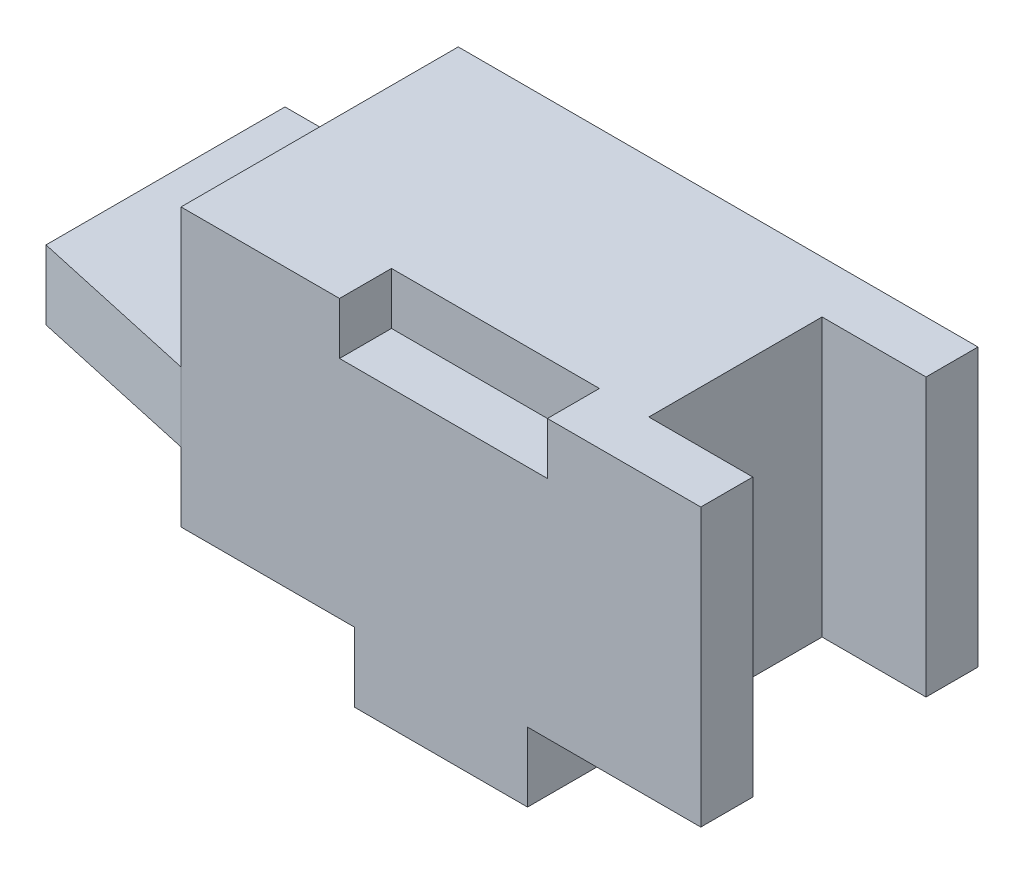
ISO-10303-21;
HEADER;
FILE_DESCRIPTION(('STEP AP214'),'2;1');
FILE_NAME('part.step','',(''),(''),'','','');
FILE_SCHEMA(('AUTOMOTIVE_DESIGN { 1 0 10303 214 1 1 1 1 }'));
ENDSEC;
DATA;
#1=APPLICATION_CONTEXT('core data for automotive mechanical design processes');
#2=APPLICATION_PROTOCOL_DEFINITION('international standard','automotive_design',2000,#1);
#3=PRODUCT_CONTEXT('',#1,'mechanical');
#4=PRODUCT('Part','Part','',(#3));
#5=PRODUCT_RELATED_PRODUCT_CATEGORY('part','',(#4));
#6=PRODUCT_DEFINITION_FORMATION('','',#4);
#7=PRODUCT_DEFINITION_CONTEXT('part definition',#1,'design');
#8=PRODUCT_DEFINITION('design','',#6,#7);
#9=PRODUCT_DEFINITION_SHAPE('','',#8);
#10=(LENGTH_UNIT() NAMED_UNIT(*) SI_UNIT(.MILLI.,.METRE.));
#11=(NAMED_UNIT(*) PLANE_ANGLE_UNIT() SI_UNIT($,.RADIAN.));
#12=(NAMED_UNIT(*) SI_UNIT($,.STERADIAN.) SOLID_ANGLE_UNIT());
#13=UNCERTAINTY_MEASURE_WITH_UNIT(LENGTH_MEASURE(1.E-05),#10,'distance_accuracy_value','');
#14=(GEOMETRIC_REPRESENTATION_CONTEXT(3) GLOBAL_UNCERTAINTY_ASSIGNED_CONTEXT((#13)) GLOBAL_UNIT_ASSIGNED_CONTEXT((#10,
#11,#12)) REPRESENTATION_CONTEXT('',''));
#15=CARTESIAN_POINT('',(0.,0.,0.));
#16=DIRECTION('',(0.,0.,1.));
#17=DIRECTION('',(1.,0.,0.));
#18=AXIS2_PLACEMENT_3D('',#15,#16,#17);
#19=CARTESIAN_POINT('',(150.,0.,80.));
#20=DIRECTION('',(-1.,0.,0.));
#21=DIRECTION('',(0.,-1.,0.));
#22=AXIS2_PLACEMENT_3D('',#19,#20,#21);
#23=PLANE('',#22);
#24=DIRECTION('',(0.,-1.,0.));
#25=VECTOR('',#24,1.);
#26=CARTESIAN_POINT('',(150.,0.,15.));
#27=LINE('',#26,#25);
#28=CARTESIAN_POINT('',(150.,0.,15.));
#29=VERTEX_POINT('',#28);
#30=CARTESIAN_POINT('',(150.,-80.,15.));
#31=VERTEX_POINT('',#30);
#32=EDGE_CURVE('E203',#29,#31,#27,.T.);
#33=ORIENTED_EDGE('',*,*,#32,.T.);
#34=DIRECTION('',(0.,0.,-1.));
#35=VECTOR('',#34,1.);
#36=CARTESIAN_POINT('',(150.,-80.,80.));
#37=LINE('',#36,#35);
#38=CARTESIAN_POINT('',(150.,-80.,0.));
#39=VERTEX_POINT('',#38);
#40=EDGE_CURVE('E318',#31,#39,#37,.T.);
#41=ORIENTED_EDGE('',*,*,#40,.T.);
#42=DIRECTION('',(0.,1.,0.));
#43=VECTOR('',#42,1.);
#44=CARTESIAN_POINT('',(150.,0.,0.));
#45=LINE('',#44,#43);
#46=CARTESIAN_POINT('',(150.,0.,0.));
#47=VERTEX_POINT('',#46);
#48=EDGE_CURVE('E289',#39,#47,#45,.T.);
#49=ORIENTED_EDGE('',*,*,#48,.T.);
#50=DIRECTION('',(0.,0.,-1.));
#51=VECTOR('',#50,1.);
#52=CARTESIAN_POINT('',(150.,0.,80.));
#53=LINE('',#52,#51);
#54=EDGE_CURVE('E315',#29,#47,#53,.T.);
#55=ORIENTED_EDGE('',*,*,#54,.F.);
#56=EDGE_LOOP('',(#33,#41,#49,#55));
#57=FACE_BOUND('',#56,.T.);
#58=ADVANCED_FACE('F36',(#57),#23,.F.);
#59=CARTESIAN_POINT('',(0.,0.,80.));
#60=DIRECTION('',(0.,0.,1.));
#61=DIRECTION('',(1.,0.,0.));
#62=AXIS2_PLACEMENT_3D('',#59,#60,#61);
#63=PLANE('',#62);
#64=DIRECTION('',(0.,-1.,0.));
#65=VECTOR('',#64,1.);
#66=CARTESIAN_POINT('',(45.7392344935598,0.,80.));
#67=LINE('',#66,#65);
#68=CARTESIAN_POINT('',(45.7392344935598,0.,80.));
#69=VERTEX_POINT('',#68);
#70=CARTESIAN_POINT('',(45.7392344935598,-15.,80.));
#71=VERTEX_POINT('',#70);
#72=EDGE_CURVE('E191',#69,#71,#67,.T.);
#73=ORIENTED_EDGE('',*,*,#72,.F.);
#74=DIRECTION('',(-1.,0.,0.));
#75=VECTOR('',#74,1.);
#76=CARTESIAN_POINT('',(0.,0.,80.));
#77=LINE('',#76,#75);
#78=CARTESIAN_POINT('',(0.,0.,80.));
#79=VERTEX_POINT('',#78);
#80=EDGE_CURVE('E271',#69,#79,#77,.T.);
#81=ORIENTED_EDGE('',*,*,#80,.T.);
#82=DIRECTION('',(0.,1.,0.));
#83=VECTOR('',#82,1.);
#84=CARTESIAN_POINT('',(0.,0.,80.));
#85=LINE('',#84,#83);
#86=CARTESIAN_POINT('',(0.,-40.,80.));
#87=VERTEX_POINT('',#86);
#88=EDGE_CURVE('E275',#87,#79,#85,.T.);
#89=ORIENTED_EDGE('',*,*,#88,.F.);
#90=DIRECTION('',(0.,1.,0.));
#91=VECTOR('',#90,1.);
#92=CARTESIAN_POINT('',(0.,-381.858552175948,80.));
#93=LINE('',#92,#91);
#94=CARTESIAN_POINT('',(0.,-60.,80.));
#95=VERTEX_POINT('',#94);
#96=EDGE_CURVE('E235',#95,#87,#93,.T.);
#97=ORIENTED_EDGE('',*,*,#96,.F.);
#98=CARTESIAN_POINT('',(0.,-80.,80.));
#99=VERTEX_POINT('',#98);
#100=EDGE_CURVE('E276',#99,#95,#85,.T.);
#101=ORIENTED_EDGE('',*,*,#100,.F.);
#102=DIRECTION('',(-1.,0.,0.));
#103=VECTOR('',#102,1.);
#104=CARTESIAN_POINT('',(0.,-80.,80.));
#105=LINE('',#104,#103);
#106=CARTESIAN_POINT('',(50.,-80.,80.));
#107=VERTEX_POINT('',#106);
#108=EDGE_CURVE('E269',#107,#99,#105,.T.);
#109=ORIENTED_EDGE('',*,*,#108,.F.);
#110=DIRECTION('',(0.,-1.,0.));
#111=VECTOR('',#110,1.);
#112=CARTESIAN_POINT('',(50.,0.,80.));
#113=LINE('',#112,#111);
#114=CARTESIAN_POINT('',(50.,-100.,80.));
#115=VERTEX_POINT('',#114);
#116=EDGE_CURVE('E279',#107,#115,#113,.T.);
#117=ORIENTED_EDGE('',*,*,#116,.T.);
#118=DIRECTION('',(1.,0.,0.));
#119=VECTOR('',#118,1.);
#120=CARTESIAN_POINT('',(0.,-100.,80.));
#121=LINE('',#120,#119);
#122=CARTESIAN_POINT('',(100.,-100.,80.));
#123=VERTEX_POINT('',#122);
#124=EDGE_CURVE('E281',#115,#123,#121,.T.);
#125=ORIENTED_EDGE('',*,*,#124,.T.);
#126=DIRECTION('',(0.,-1.,0.));
#127=VECTOR('',#126,1.);
#128=CARTESIAN_POINT('',(100.,0.,80.));
#129=LINE('',#128,#127);
#130=CARTESIAN_POINT('',(100.,-80.,80.));
#131=VERTEX_POINT('',#130);
#132=EDGE_CURVE('E261',#131,#123,#129,.T.);
#133=ORIENTED_EDGE('',*,*,#132,.F.);
#134=CARTESIAN_POINT('',(150.,-80.,80.));
#135=VERTEX_POINT('',#134);
#136=EDGE_CURVE('E264',#135,#131,#105,.T.);
#137=ORIENTED_EDGE('',*,*,#136,.F.);
#138=DIRECTION('',(0.,1.,0.));
#139=VECTOR('',#138,1.);
#140=CARTESIAN_POINT('',(150.,0.,80.));
#141=LINE('',#140,#139);
#142=CARTESIAN_POINT('',(150.,0.,80.));
#143=VERTEX_POINT('',#142);
#144=EDGE_CURVE('E268',#135,#143,#141,.T.);
#145=ORIENTED_EDGE('',*,*,#144,.T.);
#146=CARTESIAN_POINT('',(105.73923449356,0.,80.));
#147=VERTEX_POINT('',#146);
#148=EDGE_CURVE('E272',#143,#147,#77,.T.);
#149=ORIENTED_EDGE('',*,*,#148,.T.);
#150=DIRECTION('',(0.,-1.,0.));
#151=VECTOR('',#150,1.);
#152=CARTESIAN_POINT('',(105.73923449356,0.,80.));
#153=LINE('',#152,#151);
#154=CARTESIAN_POINT('',(105.73923449356,-15.,80.));
#155=VERTEX_POINT('',#154);
#156=EDGE_CURVE('E194',#147,#155,#153,.T.);
#157=ORIENTED_EDGE('',*,*,#156,.T.);
#158=DIRECTION('',(1.,0.,0.));
#159=VECTOR('',#158,1.);
#160=CARTESIAN_POINT('',(45.7392344935598,-15.,80.));
#161=LINE('',#160,#159);
#162=EDGE_CURVE('E185',#71,#155,#161,.T.);
#163=ORIENTED_EDGE('',*,*,#162,.F.);
#164=EDGE_LOOP('',(#73,#81,#89,#97,#101,#109,#117,#125,#133,#137,#145,#149,#157,#163));
#165=FACE_BOUND('',#164,.T.);
#166=ADVANCED_FACE('F376',(#165),#63,.T.);
#167=CARTESIAN_POINT('',(-50.,-60.,0.));
#168=DIRECTION('',(0.,1.,0.));
#169=DIRECTION('',(-1.,0.,0.));
#170=AXIS2_PLACEMENT_3D('',#167,#168,#169);
#171=PLANE('',#170);
#172=DIRECTION('',(-0.976512643971175,0.,-0.21546010341691));
#173=VECTOR('',#172,1.);
#174=CARTESIAN_POINT('',(-50.,-60.,68.9678794869107));
#175=LINE('',#174,#173);
#176=CARTESIAN_POINT('',(-50.,-60.,68.9678794869107));
#177=VERTEX_POINT('',#176);
#178=EDGE_CURVE('E224',#95,#177,#175,.T.);
#179=ORIENTED_EDGE('',*,*,#178,.T.);
#180=DIRECTION('',(0.,0.,1.));
#181=VECTOR('',#180,1.);
#182=CARTESIAN_POINT('',(-50.,-60.,0.));
#183=LINE('',#182,#181);
#184=CARTESIAN_POINT('',(-50.,-60.,0.));
#185=VERTEX_POINT('',#184);
#186=EDGE_CURVE('E245',#185,#177,#183,.T.);
#187=ORIENTED_EDGE('',*,*,#186,.F.);
#188=DIRECTION('',(1.,0.,0.));
#189=VECTOR('',#188,1.);
#190=CARTESIAN_POINT('',(-50.,-60.,0.));
#191=LINE('',#190,#189);
#192=CARTESIAN_POINT('',(0.,-60.,0.));
#193=VERTEX_POINT('',#192);
#194=EDGE_CURVE('E257',#185,#193,#191,.T.);
#195=ORIENTED_EDGE('',*,*,#194,.T.);
#196=DIRECTION('',(0.,0.,1.));
#197=VECTOR('',#196,1.);
#198=CARTESIAN_POINT('',(0.,-60.,0.));
#199=LINE('',#198,#197);
#200=EDGE_CURVE('E241',#193,#95,#199,.T.);
#201=ORIENTED_EDGE('',*,*,#200,.T.);
#202=EDGE_LOOP('',(#179,#187,#195,#201));
#203=FACE_BOUND('',#202,.T.);
#204=ADVANCED_FACE('F359',(#203),#171,.F.);
#205=CARTESIAN_POINT('',(-50.,-40.,0.));
#206=DIRECTION('',(0.,-1.,0.));
#207=DIRECTION('',(1.,0.,0.));
#208=AXIS2_PLACEMENT_3D('',#205,#206,#207);
#209=PLANE('',#208);
#210=DIRECTION('',(-0.976512643971175,0.,-0.21546010341691));
#211=VECTOR('',#210,1.);
#212=CARTESIAN_POINT('',(-64.5108084124147,-40.,65.7661797439485));
#213=LINE('',#212,#211);
#214=CARTESIAN_POINT('',(-50.,-40.,68.9678794869107));
#215=VERTEX_POINT('',#214);
#216=EDGE_CURVE('E238',#87,#215,#213,.T.);
#217=ORIENTED_EDGE('',*,*,#216,.F.);
#218=DIRECTION('',(0.,0.,-1.));
#219=VECTOR('',#218,1.);
#220=CARTESIAN_POINT('',(0.,-40.,0.));
#221=LINE('',#220,#219);
#222=CARTESIAN_POINT('',(0.,-40.,0.));
#223=VERTEX_POINT('',#222);
#224=EDGE_CURVE('E246',#87,#223,#221,.T.);
#225=ORIENTED_EDGE('',*,*,#224,.T.);
#226=DIRECTION('',(1.,0.,0.));
#227=VECTOR('',#226,1.);
#228=CARTESIAN_POINT('',(-50.,-40.,0.));
#229=LINE('',#228,#227);
#230=CARTESIAN_POINT('',(-50.,-40.,0.));
#231=VERTEX_POINT('',#230);
#232=EDGE_CURVE('E250',#231,#223,#229,.T.);
#233=ORIENTED_EDGE('',*,*,#232,.F.);
#234=DIRECTION('',(0.,0.,-1.));
#235=VECTOR('',#234,1.);
#236=CARTESIAN_POINT('',(-50.,-40.,0.));
#237=LINE('',#236,#235);
#238=EDGE_CURVE('E248',#215,#231,#237,.T.);
#239=ORIENTED_EDGE('',*,*,#238,.F.);
#240=EDGE_LOOP('',(#217,#225,#233,#239));
#241=FACE_BOUND('',#240,.T.);
#242=ADVANCED_FACE('F367',(#241),#209,.F.);
#243=CARTESIAN_POINT('',(-50.,0.,0.));
#244=DIRECTION('',(1.,0.,0.));
#245=DIRECTION('',(0.,1.,0.));
#246=AXIS2_PLACEMENT_3D('',#243,#244,#245);
#247=PLANE('',#246);
#248=DIRECTION('',(0.,1.,0.));
#249=VECTOR('',#248,1.);
#250=CARTESIAN_POINT('',(-50.,-381.858552175948,68.9678794869107));
#251=LINE('',#250,#249);
#252=EDGE_CURVE('E233',#177,#215,#251,.T.);
#253=ORIENTED_EDGE('',*,*,#252,.T.);
#254=ORIENTED_EDGE('',*,*,#238,.T.);
#255=DIRECTION('',(0.,-1.,0.));
#256=VECTOR('',#255,1.);
#257=CARTESIAN_POINT('',(-50.,-60.,0.));
#258=LINE('',#257,#256);
#259=EDGE_CURVE('E242',#231,#185,#258,.T.);
#260=ORIENTED_EDGE('',*,*,#259,.T.);
#261=ORIENTED_EDGE('',*,*,#186,.T.);
#262=EDGE_LOOP('',(#253,#254,#260,#261));
#263=FACE_BOUND('',#262,.T.);
#264=ADVANCED_FACE('F363',(#263),#247,.F.);
#265=CARTESIAN_POINT('',(0.,0.,80.));
#266=DIRECTION('',(-1.,0.,0.));
#267=DIRECTION('',(0.,-1.,0.));
#268=AXIS2_PLACEMENT_3D('',#265,#266,#267);
#269=PLANE('',#268);
#270=ORIENTED_EDGE('',*,*,#224,.F.);
#271=ORIENTED_EDGE('',*,*,#88,.T.);
#272=DIRECTION('',(0.,0.,-1.));
#273=VECTOR('',#272,1.);
#274=CARTESIAN_POINT('',(0.,0.,80.));
#275=LINE('',#274,#273);
#276=CARTESIAN_POINT('',(0.,0.,0.));
#277=VERTEX_POINT('',#276);
#278=EDGE_CURVE('E312',#79,#277,#275,.T.);
#279=ORIENTED_EDGE('',*,*,#278,.T.);
#280=DIRECTION('',(0.,1.,0.));
#281=VECTOR('',#280,1.);
#282=CARTESIAN_POINT('',(0.,0.,0.));
#283=LINE('',#282,#281);
#284=EDGE_CURVE('E296',#223,#277,#283,.T.);
#285=ORIENTED_EDGE('',*,*,#284,.F.);
#286=EDGE_LOOP('',(#270,#271,#279,#285));
#287=FACE_BOUND('',#286,.T.);
#288=ADVANCED_FACE('F372',(#287),#269,.T.);
#289=CARTESIAN_POINT('',(100.,0.,80.));
#290=DIRECTION('',(1.,0.,0.));
#291=DIRECTION('',(0.,0.,-1.));
#292=AXIS2_PLACEMENT_3D('',#289,#290,#291);
#293=PLANE('',#292);
#294=DIRECTION('',(0.,-1.,0.));
#295=VECTOR('',#294,1.);
#296=CARTESIAN_POINT('',(100.,0.,0.));
#297=LINE('',#296,#295);
#298=CARTESIAN_POINT('',(100.,-80.,0.));
#299=VERTEX_POINT('',#298);
#300=CARTESIAN_POINT('',(100.,-100.,0.));
#301=VERTEX_POINT('',#300);
#302=EDGE_CURVE('E260',#299,#301,#297,.T.);
#303=ORIENTED_EDGE('',*,*,#302,.F.);
#304=DIRECTION('',(0.,0.,-1.));
#305=VECTOR('',#304,1.);
#306=CARTESIAN_POINT('',(100.,-80.,80.));
#307=LINE('',#306,#305);
#308=EDGE_CURVE('E11',#131,#299,#307,.T.);
#309=ORIENTED_EDGE('',*,*,#308,.F.);
#310=ORIENTED_EDGE('',*,*,#132,.T.);
#311=DIRECTION('',(0.,0.,-1.));
#312=VECTOR('',#311,1.);
#313=CARTESIAN_POINT('',(100.,-100.,80.));
#314=LINE('',#313,#312);
#315=EDGE_CURVE('E283',#123,#301,#314,.T.);
#316=ORIENTED_EDGE('',*,*,#315,.T.);
#317=EDGE_LOOP('',(#303,#309,#310,#316));
#318=FACE_BOUND('',#317,.T.);
#319=ADVANCED_FACE('F38',(#318),#293,.T.);
#320=CARTESIAN_POINT('',(0.,-80.,80.));
#321=DIRECTION('',(0.,-1.,0.));
#322=DIRECTION('',(1.,0.,0.));
#323=AXIS2_PLACEMENT_3D('',#320,#321,#322);
#324=PLANE('',#323);
#325=DIRECTION('',(1.,0.,0.));
#326=VECTOR('',#325,1.);
#327=CARTESIAN_POINT('',(120.,-80.,65.));
#328=LINE('',#327,#326);
#329=CARTESIAN_POINT('',(120.,-80.,65.));
#330=VERTEX_POINT('',#329);
#331=CARTESIAN_POINT('',(150.,-80.,65.));
#332=VERTEX_POINT('',#331);
#333=EDGE_CURVE('E221',#330,#332,#328,.T.);
#334=ORIENTED_EDGE('',*,*,#333,.T.);
#335=EDGE_CURVE('E44',#135,#332,#37,.T.);
#336=ORIENTED_EDGE('',*,*,#335,.F.);
#337=ORIENTED_EDGE('',*,*,#136,.T.);
#338=ORIENTED_EDGE('',*,*,#308,.T.);
#339=DIRECTION('',(-1.,0.,0.));
#340=VECTOR('',#339,1.);
#341=CARTESIAN_POINT('',(0.,-80.,0.));
#342=LINE('',#341,#340);
#343=EDGE_CURVE('E286',#39,#299,#342,.T.);
#344=ORIENTED_EDGE('',*,*,#343,.F.);
#345=ORIENTED_EDGE('',*,*,#40,.F.);
#346=DIRECTION('',(1.,0.,0.));
#347=VECTOR('',#346,1.);
#348=CARTESIAN_POINT('',(120.,-80.,15.));
#349=LINE('',#348,#347);
#350=CARTESIAN_POINT('',(120.,-80.,15.));
#351=VERTEX_POINT('',#350);
#352=EDGE_CURVE('E217',#351,#31,#349,.T.);
#353=ORIENTED_EDGE('',*,*,#352,.F.);
#354=DIRECTION('',(0.,0.,-1.));
#355=VECTOR('',#354,1.);
#356=CARTESIAN_POINT('',(120.,-80.,65.));
#357=LINE('',#356,#355);
#358=EDGE_CURVE('E207',#330,#351,#357,.T.);
#359=ORIENTED_EDGE('',*,*,#358,.F.);
#360=EDGE_LOOP('',(#334,#336,#337,#338,#344,#345,#353,#359));
#361=FACE_BOUND('',#360,.T.);
#362=ADVANCED_FACE('F333',(#361),#324,.T.);
#363=ORIENTED_EDGE('',*,*,#335,.T.);
#364=DIRECTION('',(0.,-1.,0.));
#365=VECTOR('',#364,1.);
#366=CARTESIAN_POINT('',(150.,0.,65.));
#367=LINE('',#366,#365);
#368=CARTESIAN_POINT('',(150.,0.,65.));
#369=VERTEX_POINT('',#368);
#370=EDGE_CURVE('E209',#369,#332,#367,.T.);
#371=ORIENTED_EDGE('',*,*,#370,.F.);
#372=EDGE_CURVE('E316',#143,#369,#53,.T.);
#373=ORIENTED_EDGE('',*,*,#372,.F.);
#374=ORIENTED_EDGE('',*,*,#144,.F.);
#375=EDGE_LOOP('',(#363,#371,#373,#374));
#376=FACE_BOUND('',#375,.T.);
#377=ADVANCED_FACE('F395',(#376),#23,.F.);
#378=CARTESIAN_POINT('',(0.,0.,80.));
#379=DIRECTION('',(0.,-1.,0.));
#380=DIRECTION('',(1.,0.,0.));
#381=AXIS2_PLACEMENT_3D('',#378,#379,#380);
#382=PLANE('',#381);
#383=ORIENTED_EDGE('',*,*,#80,.F.);
#384=DIRECTION('',(0.,0.,1.));
#385=VECTOR('',#384,1.);
#386=CARTESIAN_POINT('',(45.7392344935598,0.,65.));
#387=LINE('',#386,#385);
#388=CARTESIAN_POINT('',(45.7392344935598,0.,65.));
#389=VERTEX_POINT('',#388);
#390=EDGE_CURVE('E204',#389,#69,#387,.T.);
#391=ORIENTED_EDGE('',*,*,#390,.F.);
#392=DIRECTION('',(1.,0.,0.));
#393=VECTOR('',#392,1.);
#394=CARTESIAN_POINT('',(45.7392344935598,0.,65.));
#395=LINE('',#394,#393);
#396=CARTESIAN_POINT('',(105.73923449356,0.,65.));
#397=VERTEX_POINT('',#396);
#398=EDGE_CURVE('E177',#389,#397,#395,.T.);
#399=ORIENTED_EDGE('',*,*,#398,.T.);
#400=DIRECTION('',(0.,0.,1.));
#401=VECTOR('',#400,1.);
#402=CARTESIAN_POINT('',(105.73923449356,0.,65.));
#403=LINE('',#402,#401);
#404=EDGE_CURVE('E175',#397,#147,#403,.T.);
#405=ORIENTED_EDGE('',*,*,#404,.T.);
#406=ORIENTED_EDGE('',*,*,#148,.F.);
#407=ORIENTED_EDGE('',*,*,#372,.T.);
#408=DIRECTION('',(1.,0.,0.));
#409=VECTOR('',#408,1.);
#410=CARTESIAN_POINT('',(120.,0.,65.));
#411=LINE('',#410,#409);
#412=CARTESIAN_POINT('',(120.,0.,65.));
#413=VERTEX_POINT('',#412);
#414=EDGE_CURVE('E225',#413,#369,#411,.T.);
#415=ORIENTED_EDGE('',*,*,#414,.F.);
#416=DIRECTION('',(0.,0.,-1.));
#417=VECTOR('',#416,1.);
#418=CARTESIAN_POINT('',(120.,0.,65.));
#419=LINE('',#418,#417);
#420=CARTESIAN_POINT('',(120.,0.,15.));
#421=VERTEX_POINT('',#420);
#422=EDGE_CURVE('E211',#413,#421,#419,.T.);
#423=ORIENTED_EDGE('',*,*,#422,.T.);
#424=DIRECTION('',(1.,0.,0.));
#425=VECTOR('',#424,1.);
#426=CARTESIAN_POINT('',(120.,0.,15.));
#427=LINE('',#426,#425);
#428=EDGE_CURVE('E227',#421,#29,#427,.T.);
#429=ORIENTED_EDGE('',*,*,#428,.T.);
#430=ORIENTED_EDGE('',*,*,#54,.T.);
#431=DIRECTION('',(-1.,0.,0.));
#432=VECTOR('',#431,1.);
#433=CARTESIAN_POINT('',(0.,0.,0.));
#434=LINE('',#433,#432);
#435=EDGE_CURVE('E293',#47,#277,#434,.T.);
#436=ORIENTED_EDGE('',*,*,#435,.T.);
#437=ORIENTED_EDGE('',*,*,#278,.F.);
#438=EDGE_LOOP('',(#383,#391,#399,#405,#406,#407,#415,#423,#429,#430,#436,#437));
#439=FACE_BOUND('',#438,.T.);
#440=ADVANCED_FACE('F402',(#439),#382,.F.);
#441=ORIENTED_EDGE('',*,*,#200,.F.);
#442=CARTESIAN_POINT('',(0.,-80.,0.));
#443=VERTEX_POINT('',#442);
#444=EDGE_CURVE('E297',#443,#193,#283,.T.);
#445=ORIENTED_EDGE('',*,*,#444,.F.);
#446=DIRECTION('',(0.,0.,-1.));
#447=VECTOR('',#446,1.);
#448=CARTESIAN_POINT('',(0.,-80.,80.));
#449=LINE('',#448,#447);
#450=EDGE_CURVE('E310',#99,#443,#449,.T.);
#451=ORIENTED_EDGE('',*,*,#450,.F.);
#452=ORIENTED_EDGE('',*,*,#100,.T.);
#453=EDGE_LOOP('',(#441,#445,#451,#452));
#454=FACE_BOUND('',#453,.T.);
#455=ADVANCED_FACE('F407',(#454),#269,.T.);
#456=CARTESIAN_POINT('',(50.,-80.,0.));
#457=VERTEX_POINT('',#456);
#458=EDGE_CURVE('E290',#457,#443,#342,.T.);
#459=ORIENTED_EDGE('',*,*,#458,.F.);
#460=DIRECTION('',(0.,0.,-1.));
#461=VECTOR('',#460,1.);
#462=CARTESIAN_POINT('',(50.,-80.,80.));
#463=LINE('',#462,#461);
#464=EDGE_CURVE('E308',#107,#457,#463,.T.);
#465=ORIENTED_EDGE('',*,*,#464,.F.);
#466=ORIENTED_EDGE('',*,*,#108,.T.);
#467=ORIENTED_EDGE('',*,*,#450,.T.);
#468=EDGE_LOOP('',(#459,#465,#466,#467));
#469=FACE_BOUND('',#468,.T.);
#470=ADVANCED_FACE('F353',(#469),#324,.T.);
#471=CARTESIAN_POINT('',(50.,0.,80.));
#472=DIRECTION('',(1.,0.,0.));
#473=DIRECTION('',(0.,0.,-1.));
#474=AXIS2_PLACEMENT_3D('',#471,#472,#473);
#475=PLANE('',#474);
#476=DIRECTION('',(0.,-1.,0.));
#477=VECTOR('',#476,1.);
#478=CARTESIAN_POINT('',(50.,0.,0.));
#479=LINE('',#478,#477);
#480=CARTESIAN_POINT('',(50.,-100.,0.));
#481=VERTEX_POINT('',#480);
#482=EDGE_CURVE('E300',#457,#481,#479,.T.);
#483=ORIENTED_EDGE('',*,*,#482,.T.);
#484=DIRECTION('',(0.,0.,-1.));
#485=VECTOR('',#484,1.);
#486=CARTESIAN_POINT('',(50.,-100.,80.));
#487=LINE('',#486,#485);
#488=EDGE_CURVE('E305',#115,#481,#487,.T.);
#489=ORIENTED_EDGE('',*,*,#488,.F.);
#490=ORIENTED_EDGE('',*,*,#116,.F.);
#491=ORIENTED_EDGE('',*,*,#464,.T.);
#492=EDGE_LOOP('',(#483,#489,#490,#491));
#493=FACE_BOUND('',#492,.T.);
#494=ADVANCED_FACE('F349',(#493),#475,.F.);
#495=CARTESIAN_POINT('',(0.,-100.,80.));
#496=DIRECTION('',(0.,1.,0.));
#497=DIRECTION('',(-1.,0.,0.));
#498=AXIS2_PLACEMENT_3D('',#495,#496,#497);
#499=PLANE('',#498);
#500=DIRECTION('',(1.,0.,0.));
#501=VECTOR('',#500,1.);
#502=CARTESIAN_POINT('',(0.,-100.,0.));
#503=LINE('',#502,#501);
#504=EDGE_CURVE('E265',#481,#301,#503,.T.);
#505=ORIENTED_EDGE('',*,*,#504,.T.);
#506=ORIENTED_EDGE('',*,*,#315,.F.);
#507=ORIENTED_EDGE('',*,*,#124,.F.);
#508=ORIENTED_EDGE('',*,*,#488,.T.);
#509=EDGE_LOOP('',(#505,#506,#507,#508));
#510=FACE_BOUND('',#509,.T.);
#511=ADVANCED_FACE('F344',(#510),#499,.F.);
#512=CARTESIAN_POINT('',(0.,0.,0.));
#513=DIRECTION('',(0.,0.,1.));
#514=DIRECTION('',(1.,0.,0.));
#515=AXIS2_PLACEMENT_3D('',#512,#513,#514);
#516=PLANE('',#515);
#517=ORIENTED_EDGE('',*,*,#302,.T.);
#518=ORIENTED_EDGE('',*,*,#504,.F.);
#519=ORIENTED_EDGE('',*,*,#482,.F.);
#520=ORIENTED_EDGE('',*,*,#458,.T.);
#521=ORIENTED_EDGE('',*,*,#444,.T.);
#522=ORIENTED_EDGE('',*,*,#194,.F.);
#523=ORIENTED_EDGE('',*,*,#259,.F.);
#524=ORIENTED_EDGE('',*,*,#232,.T.);
#525=ORIENTED_EDGE('',*,*,#284,.T.);
#526=ORIENTED_EDGE('',*,*,#435,.F.);
#527=ORIENTED_EDGE('',*,*,#48,.F.);
#528=ORIENTED_EDGE('',*,*,#343,.T.);
#529=EDGE_LOOP('',(#517,#518,#519,#520,#521,#522,#523,#524,#525,#526,#527,#528));
#530=FACE_BOUND('',#529,.T.);
#531=ADVANCED_FACE('F332',(#530),#516,.F.);
#532=CARTESIAN_POINT('',(-50.,-381.858552175948,68.9678794869107));
#533=DIRECTION('',(-0.21546010341691,0.,0.976512643971175));
#534=DIRECTION('',(0.976512643971175,0.,0.21546010341691));
#535=AXIS2_PLACEMENT_3D('',#532,#533,#534);
#536=PLANE('',#535);
#537=ORIENTED_EDGE('',*,*,#96,.T.);
#538=ORIENTED_EDGE('',*,*,#216,.T.);
#539=ORIENTED_EDGE('',*,*,#252,.F.);
#540=ORIENTED_EDGE('',*,*,#178,.F.);
#541=EDGE_LOOP('',(#537,#538,#539,#540));
#542=FACE_BOUND('',#541,.T.);
#543=ADVANCED_FACE('F380',(#542),#536,.T.);
#544=CARTESIAN_POINT('',(120.,0.,65.));
#545=DIRECTION('',(0.,0.,1.));
#546=DIRECTION('',(0.,-1.,0.));
#547=AXIS2_PLACEMENT_3D('',#544,#545,#546);
#548=PLANE('',#547);
#549=ORIENTED_EDGE('',*,*,#370,.T.);
#550=ORIENTED_EDGE('',*,*,#333,.F.);
#551=DIRECTION('',(0.,-1.,0.));
#552=VECTOR('',#551,1.);
#553=CARTESIAN_POINT('',(120.,0.,65.));
#554=LINE('',#553,#552);
#555=EDGE_CURVE('E214',#413,#330,#554,.T.);
#556=ORIENTED_EDGE('',*,*,#555,.F.);
#557=ORIENTED_EDGE('',*,*,#414,.T.);
#558=EDGE_LOOP('',(#549,#550,#556,#557));
#559=FACE_BOUND('',#558,.T.);
#560=ADVANCED_FACE('F382',(#559),#548,.F.);
#561=CARTESIAN_POINT('',(120.,0.,15.));
#562=DIRECTION('',(0.,0.,1.));
#563=DIRECTION('',(0.,-1.,0.));
#564=AXIS2_PLACEMENT_3D('',#561,#562,#563);
#565=PLANE('',#564);
#566=ORIENTED_EDGE('',*,*,#32,.F.);
#567=ORIENTED_EDGE('',*,*,#428,.F.);
#568=DIRECTION('',(0.,-1.,0.));
#569=VECTOR('',#568,1.);
#570=CARTESIAN_POINT('',(120.,0.,15.));
#571=LINE('',#570,#569);
#572=EDGE_CURVE('E59',#421,#351,#571,.T.);
#573=ORIENTED_EDGE('',*,*,#572,.T.);
#574=ORIENTED_EDGE('',*,*,#352,.T.);
#575=EDGE_LOOP('',(#566,#567,#573,#574));
#576=FACE_BOUND('',#575,.T.);
#577=ADVANCED_FACE('F388',(#576),#565,.T.);
#578=CARTESIAN_POINT('',(120.,0.,0.));
#579=DIRECTION('',(-1.,0.,0.));
#580=DIRECTION('',(0.,-1.,0.));
#581=AXIS2_PLACEMENT_3D('',#578,#579,#580);
#582=PLANE('',#581);
#583=ORIENTED_EDGE('',*,*,#358,.T.);
#584=ORIENTED_EDGE('',*,*,#572,.F.);
#585=ORIENTED_EDGE('',*,*,#422,.F.);
#586=ORIENTED_EDGE('',*,*,#555,.T.);
#587=EDGE_LOOP('',(#583,#584,#585,#586));
#588=FACE_BOUND('',#587,.T.);
#589=ADVANCED_FACE('F512',(#588),#582,.F.);
#590=CARTESIAN_POINT('',(45.7392344935598,-15.,65.));
#591=DIRECTION('',(0.,-1.,0.));
#592=DIRECTION('',(0.,0.,-1.));
#593=AXIS2_PLACEMENT_3D('',#590,#591,#592);
#594=PLANE('',#593);
#595=ORIENTED_EDGE('',*,*,#162,.T.);
#596=DIRECTION('',(0.,0.,1.));
#597=VECTOR('',#596,1.);
#598=CARTESIAN_POINT('',(105.73923449356,-15.,65.));
#599=LINE('',#598,#597);
#600=CARTESIAN_POINT('',(105.73923449356,-15.,65.));
#601=VERTEX_POINT('',#600);
#602=EDGE_CURVE('E172',#601,#155,#599,.T.);
#603=ORIENTED_EDGE('',*,*,#602,.F.);
#604=DIRECTION('',(1.,0.,0.));
#605=VECTOR('',#604,1.);
#606=CARTESIAN_POINT('',(45.7392344935598,-15.,65.));
#607=LINE('',#606,#605);
#608=CARTESIAN_POINT('',(45.7392344935598,-15.,65.));
#609=VERTEX_POINT('',#608);
#610=EDGE_CURVE('E178',#609,#601,#607,.T.);
#611=ORIENTED_EDGE('',*,*,#610,.F.);
#612=DIRECTION('',(0.,0.,1.));
#613=VECTOR('',#612,1.);
#614=CARTESIAN_POINT('',(45.7392344935598,-15.,65.));
#615=LINE('',#614,#613);
#616=EDGE_CURVE('E201',#609,#71,#615,.T.);
#617=ORIENTED_EDGE('',*,*,#616,.T.);
#618=EDGE_LOOP('',(#595,#603,#611,#617));
#619=FACE_BOUND('',#618,.T.);
#620=ADVANCED_FACE('F182',(#619),#594,.F.);
#621=CARTESIAN_POINT('',(45.7392344935598,0.,65.));
#622=DIRECTION('',(-1.,0.,0.));
#623=DIRECTION('',(0.,0.,1.));
#624=AXIS2_PLACEMENT_3D('',#621,#622,#623);
#625=PLANE('',#624);
#626=ORIENTED_EDGE('',*,*,#72,.T.);
#627=ORIENTED_EDGE('',*,*,#616,.F.);
#628=DIRECTION('',(0.,-1.,0.));
#629=VECTOR('',#628,1.);
#630=CARTESIAN_POINT('',(45.7392344935598,0.,65.));
#631=LINE('',#630,#629);
#632=EDGE_CURVE('E187',#389,#609,#631,.T.);
#633=ORIENTED_EDGE('',*,*,#632,.F.);
#634=ORIENTED_EDGE('',*,*,#390,.T.);
#635=EDGE_LOOP('',(#626,#627,#633,#634));
#636=FACE_BOUND('',#635,.T.);
#637=ADVANCED_FACE('F539',(#636),#625,.F.);
#638=CARTESIAN_POINT('',(105.73923449356,0.,65.));
#639=DIRECTION('',(-1.,0.,0.));
#640=DIRECTION('',(0.,0.,1.));
#641=AXIS2_PLACEMENT_3D('',#638,#639,#640);
#642=PLANE('',#641);
#643=ORIENTED_EDGE('',*,*,#156,.F.);
#644=ORIENTED_EDGE('',*,*,#404,.F.);
#645=DIRECTION('',(0.,-1.,0.));
#646=VECTOR('',#645,1.);
#647=CARTESIAN_POINT('',(105.73923449356,0.,65.));
#648=LINE('',#647,#646);
#649=EDGE_CURVE('E51',#397,#601,#648,.T.);
#650=ORIENTED_EDGE('',*,*,#649,.T.);
#651=ORIENTED_EDGE('',*,*,#602,.T.);
#652=EDGE_LOOP('',(#643,#644,#650,#651));
#653=FACE_BOUND('',#652,.T.);
#654=ADVANCED_FACE('F171',(#653),#642,.T.);
#655=CARTESIAN_POINT('',(0.,0.,65.));
#656=DIRECTION('',(0.,0.,-1.));
#657=DIRECTION('',(-1.,0.,0.));
#658=AXIS2_PLACEMENT_3D('',#655,#656,#657);
#659=PLANE('',#658);
#660=ORIENTED_EDGE('',*,*,#610,.T.);
#661=ORIENTED_EDGE('',*,*,#649,.F.);
#662=ORIENTED_EDGE('',*,*,#398,.F.);
#663=ORIENTED_EDGE('',*,*,#632,.T.);
#664=EDGE_LOOP('',(#660,#661,#662,#663));
#665=FACE_BOUND('',#664,.T.);
#666=ADVANCED_FACE('F189',(#665),#659,.F.);
#667=CLOSED_SHELL('',(#58,#166,#204,#242,#264,#288,#319,#362,#377,#440,#455,#470,#494,#511,#531,
#543,#560,#577,#589,#620,#637,#654,#666));
#668=MANIFOLD_SOLID_BREP('B2',#667);
#669=ADVANCED_BREP_SHAPE_REPRESENTATION('',(#18,#668),#14);
#670=SHAPE_DEFINITION_REPRESENTATION(#9,#669);
ENDSEC;
END-ISO-10303-21;
